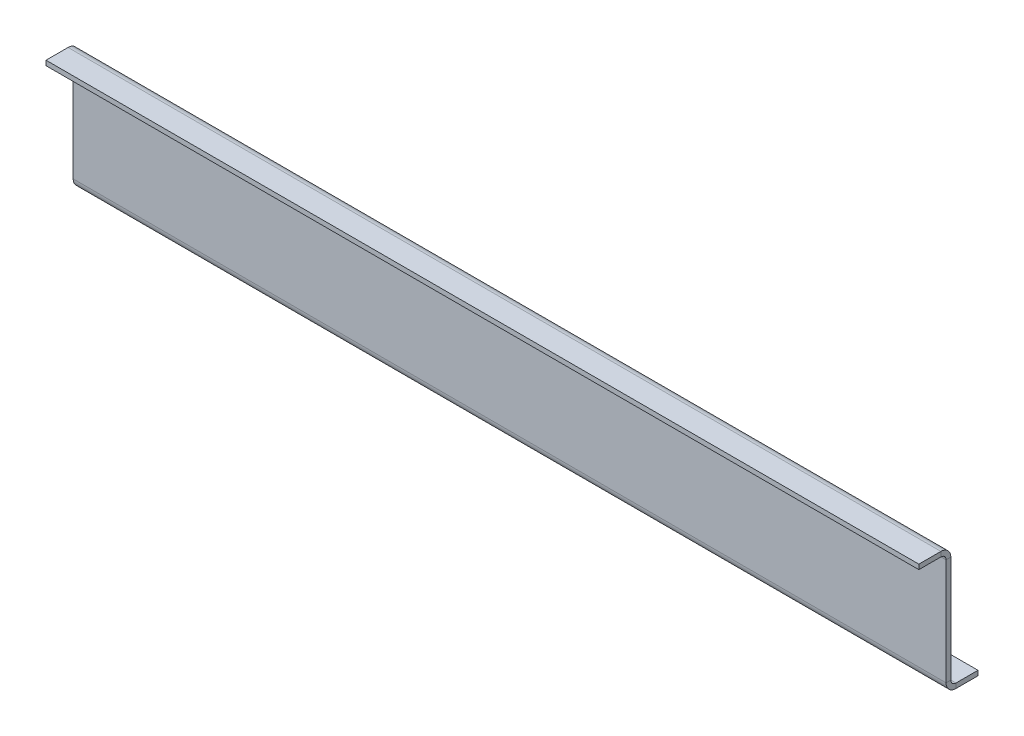
ISO-10303-21;
HEADER;
FILE_DESCRIPTION(('STEP AP214'),'2;1');
FILE_NAME('part.step','',(''),(''),'','','');
FILE_SCHEMA(('AUTOMOTIVE_DESIGN { 1 0 10303 214 1 1 1 1 }'));
ENDSEC;
DATA;
#1=APPLICATION_CONTEXT('core data for automotive mechanical design processes');
#2=APPLICATION_PROTOCOL_DEFINITION('international standard','automotive_design',2000,#1);
#3=PRODUCT_CONTEXT('',#1,'mechanical');
#4=PRODUCT('Part','Part','',(#3));
#5=PRODUCT_RELATED_PRODUCT_CATEGORY('part','',(#4));
#6=PRODUCT_DEFINITION_FORMATION('','',#4);
#7=PRODUCT_DEFINITION_CONTEXT('part definition',#1,'design');
#8=PRODUCT_DEFINITION('design','',#6,#7);
#9=PRODUCT_DEFINITION_SHAPE('','',#8);
#10=(LENGTH_UNIT() NAMED_UNIT(*) SI_UNIT(.MILLI.,.METRE.));
#11=(NAMED_UNIT(*) PLANE_ANGLE_UNIT() SI_UNIT($,.RADIAN.));
#12=(NAMED_UNIT(*) SI_UNIT($,.STERADIAN.) SOLID_ANGLE_UNIT());
#13=UNCERTAINTY_MEASURE_WITH_UNIT(LENGTH_MEASURE(1.E-05),#10,'distance_accuracy_value','');
#14=(GEOMETRIC_REPRESENTATION_CONTEXT(3) GLOBAL_UNCERTAINTY_ASSIGNED_CONTEXT((#13)) GLOBAL_UNIT_ASSIGNED_CONTEXT((#10,
#11,#12)) REPRESENTATION_CONTEXT('',''));
#15=CARTESIAN_POINT('',(0.,0.,0.));
#16=DIRECTION('',(0.,0.,1.));
#17=DIRECTION('',(1.,0.,0.));
#18=AXIS2_PLACEMENT_3D('',#15,#16,#17);
#19=CARTESIAN_POINT('',(-136.5,-19.75,-1.5));
#20=DIRECTION('',(-1.,0.,0.));
#21=DIRECTION('',(0.,0.,1.));
#22=AXIS2_PLACEMENT_3D('',#19,#20,#21);
#23=PLANE('',#22);
#24=DIRECTION('',(0.,-1.,0.));
#25=VECTOR('',#24,1.);
#26=CARTESIAN_POINT('',(-136.5,-19.75,-1.5));
#27=LINE('',#26,#25);
#28=CARTESIAN_POINT('',(-136.5,16.65,-1.5));
#29=VERTEX_POINT('',#28);
#30=CARTESIAN_POINT('',(-136.5,-16.65,-1.49999999999999));
#31=VERTEX_POINT('',#30);
#32=EDGE_CURVE('E87',#29,#31,#27,.T.);
#33=ORIENTED_EDGE('',*,*,#32,.T.);
#34=DIRECTION('',(0.,0.,1.));
#35=VECTOR('',#34,1.);
#36=CARTESIAN_POINT('',(-136.5,-16.65,-1.49999999999999));
#37=LINE('',#36,#35);
#38=CARTESIAN_POINT('',(-136.5,-16.65,0.));
#39=VERTEX_POINT('',#38);
#40=EDGE_CURVE('E226',#31,#39,#37,.T.);
#41=ORIENTED_EDGE('',*,*,#40,.T.);
#42=DIRECTION('',(0.,-1.,0.));
#43=VECTOR('',#42,1.);
#44=CARTESIAN_POINT('',(-136.5,-19.75,0.));
#45=LINE('',#44,#43);
#46=CARTESIAN_POINT('',(-136.5,16.65,0.));
#47=VERTEX_POINT('',#46);
#48=EDGE_CURVE('E288',#47,#39,#45,.T.);
#49=ORIENTED_EDGE('',*,*,#48,.F.);
#50=DIRECTION('',(0.,0.,-1.));
#51=VECTOR('',#50,1.);
#52=CARTESIAN_POINT('',(-136.5,16.65,0.));
#53=LINE('',#52,#51);
#54=EDGE_CURVE('E276',#47,#29,#53,.T.);
#55=ORIENTED_EDGE('',*,*,#54,.T.);
#56=EDGE_LOOP('',(#33,#41,#49,#55));
#57=FACE_BOUND('',#56,.T.);
#58=ADVANCED_FACE('F79',(#57),#23,.T.);
#59=CARTESIAN_POINT('',(0.,0.,-1.5));
#60=DIRECTION('',(0.,0.,1.));
#61=DIRECTION('',(1.,0.,0.));
#62=AXIS2_PLACEMENT_3D('',#59,#60,#61);
#63=PLANE('',#62);
#64=DIRECTION('',(-1.,0.,0.));
#65=VECTOR('',#64,1.);
#66=CARTESIAN_POINT('',(-136.5,-16.65,-1.49999999999999));
#67=LINE('',#66,#65);
#68=CARTESIAN_POINT('',(136.5,-16.65,-1.50000000000003));
#69=VERTEX_POINT('',#68);
#70=EDGE_CURVE('E230',#31,#69,#67,.F.);
#71=ORIENTED_EDGE('',*,*,#70,.F.);
#72=ORIENTED_EDGE('',*,*,#32,.F.);
#73=DIRECTION('',(-1.,0.,0.));
#74=VECTOR('',#73,1.);
#75=CARTESIAN_POINT('',(-136.5,16.65,-1.5));
#76=LINE('',#75,#74);
#77=CARTESIAN_POINT('',(136.5,16.65,-1.5));
#78=VERTEX_POINT('',#77);
#79=EDGE_CURVE('E270',#29,#78,#76,.F.);
#80=ORIENTED_EDGE('',*,*,#79,.T.);
#81=DIRECTION('',(0.,1.,0.));
#82=VECTOR('',#81,1.);
#83=CARTESIAN_POINT('',(136.5,-19.75,-1.5));
#84=LINE('',#83,#82);
#85=EDGE_CURVE('E13',#69,#78,#84,.T.);
#86=ORIENTED_EDGE('',*,*,#85,.F.);
#87=EDGE_LOOP('',(#71,#72,#80,#86));
#88=FACE_BOUND('',#87,.T.);
#89=ADVANCED_FACE('F330',(#88),#63,.F.);
#90=CARTESIAN_POINT('',(0.,0.,0.));
#91=DIRECTION('',(0.,0.,1.));
#92=DIRECTION('',(1.,0.,0.));
#93=AXIS2_PLACEMENT_3D('',#90,#91,#92);
#94=PLANE('',#93);
#95=ORIENTED_EDGE('',*,*,#48,.T.);
#96=DIRECTION('',(-1.,0.,0.));
#97=VECTOR('',#96,1.);
#98=CARTESIAN_POINT('',(-136.5,-16.65,0.));
#99=LINE('',#98,#97);
#100=CARTESIAN_POINT('',(136.5,-16.65,0.));
#101=VERTEX_POINT('',#100);
#102=EDGE_CURVE('E176',#39,#101,#99,.F.);
#103=ORIENTED_EDGE('',*,*,#102,.T.);
#104=DIRECTION('',(0.,1.,0.));
#105=VECTOR('',#104,1.);
#106=CARTESIAN_POINT('',(136.5,-19.75,0.));
#107=LINE('',#106,#105);
#108=CARTESIAN_POINT('',(136.5,16.65,0.));
#109=VERTEX_POINT('',#108);
#110=EDGE_CURVE('E82',#101,#109,#107,.T.);
#111=ORIENTED_EDGE('',*,*,#110,.T.);
#112=DIRECTION('',(-1.,0.,0.));
#113=VECTOR('',#112,1.);
#114=CARTESIAN_POINT('',(-136.5,16.65,0.));
#115=LINE('',#114,#113);
#116=EDGE_CURVE('E95',#47,#109,#115,.F.);
#117=ORIENTED_EDGE('',*,*,#116,.F.);
#118=EDGE_LOOP('',(#95,#103,#111,#117));
#119=FACE_BOUND('',#118,.T.);
#120=ADVANCED_FACE('F293',(#119),#94,.T.);
#121=CARTESIAN_POINT('',(136.5,-19.75,-1.5));
#122=DIRECTION('',(1.,0.,0.));
#123=DIRECTION('',(0.,0.,-1.));
#124=AXIS2_PLACEMENT_3D('',#121,#122,#123);
#125=PLANE('',#124);
#126=DIRECTION('',(0.,0.,1.));
#127=VECTOR('',#126,1.);
#128=CARTESIAN_POINT('',(136.5,-16.65,-1.50000000000003));
#129=LINE('',#128,#127);
#130=EDGE_CURVE('E233',#69,#101,#129,.T.);
#131=ORIENTED_EDGE('',*,*,#130,.F.);
#132=ORIENTED_EDGE('',*,*,#85,.T.);
#133=DIRECTION('',(0.,0.,-1.));
#134=VECTOR('',#133,1.);
#135=CARTESIAN_POINT('',(136.5,16.65,0.));
#136=LINE('',#135,#134);
#137=EDGE_CURVE('E285',#109,#78,#136,.T.);
#138=ORIENTED_EDGE('',*,*,#137,.F.);
#139=ORIENTED_EDGE('',*,*,#110,.F.);
#140=EDGE_LOOP('',(#131,#132,#138,#139));
#141=FACE_BOUND('',#140,.T.);
#142=ADVANCED_FACE('F294',(#141),#125,.T.);
#143=CARTESIAN_POINT('',(136.5,16.65,1.6));
#144=DIRECTION('',(1.,0.,0.));
#145=DIRECTION('',(0.,0.,-1.));
#146=AXIS2_PLACEMENT_3D('',#143,#144,#145);
#147=PLANE('',#146);
#148=DIRECTION('',(0.,1.,0.));
#149=VECTOR('',#148,1.);
#150=CARTESIAN_POINT('',(136.5,19.75,1.59999999999999));
#151=LINE('',#150,#149);
#152=CARTESIAN_POINT('',(136.5,18.25,1.59999999999999));
#153=VERTEX_POINT('',#152);
#154=CARTESIAN_POINT('',(136.5,19.75,1.59999999999999));
#155=VERTEX_POINT('',#154);
#156=EDGE_CURVE('E236',#153,#155,#151,.T.);
#157=ORIENTED_EDGE('',*,*,#156,.F.);
#158=CARTESIAN_POINT('',(136.5,16.65,1.6));
#159=DIRECTION('',(-1.,0.,0.));
#160=DIRECTION('',(0.,0.,1.));
#161=AXIS2_PLACEMENT_3D('',#158,#159,#160);
#162=CIRCLE('',#161,1.60000000000002);
#163=EDGE_CURVE('E279',#109,#153,#162,.F.);
#164=ORIENTED_EDGE('',*,*,#163,.F.);
#165=ORIENTED_EDGE('',*,*,#137,.T.);
#166=CARTESIAN_POINT('',(136.5,16.65,1.6));
#167=DIRECTION('',(-1.,0.,0.));
#168=DIRECTION('',(0.,0.,1.));
#169=AXIS2_PLACEMENT_3D('',#166,#167,#168);
#170=CIRCLE('',#169,3.10000000000002);
#171=EDGE_CURVE('E272',#78,#155,#170,.F.);
#172=ORIENTED_EDGE('',*,*,#171,.T.);
#173=EDGE_LOOP('',(#157,#164,#165,#172));
#174=FACE_BOUND('',#173,.T.);
#175=ADVANCED_FACE('F302',(#174),#147,.T.);
#176=CARTESIAN_POINT('',(-136.5,16.65,1.60000000000002));
#177=DIRECTION('',(1.,0.,0.));
#178=DIRECTION('',(0.,0.,-1.));
#179=AXIS2_PLACEMENT_3D('',#176,#177,#178);
#180=PLANE('',#179);
#181=CARTESIAN_POINT('',(-136.5,16.65,1.60000000000002));
#182=DIRECTION('',(-1.,0.,0.));
#183=DIRECTION('',(0.,0.,1.));
#184=AXIS2_PLACEMENT_3D('',#181,#182,#183);
#185=CIRCLE('',#184,1.60000000000002);
#186=CARTESIAN_POINT('',(-136.5,18.25,1.60000000000001));
#187=VERTEX_POINT('',#186);
#188=EDGE_CURVE('E240',#187,#47,#185,.T.);
#189=ORIENTED_EDGE('',*,*,#188,.F.);
#190=DIRECTION('',(0.,1.,0.));
#191=VECTOR('',#190,1.);
#192=CARTESIAN_POINT('',(-136.5,18.25,1.60000000000001));
#193=LINE('',#192,#191);
#194=CARTESIAN_POINT('',(-136.5,19.75,1.6));
#195=VERTEX_POINT('',#194);
#196=EDGE_CURVE('E263',#187,#195,#193,.T.);
#197=ORIENTED_EDGE('',*,*,#196,.T.);
#198=CARTESIAN_POINT('',(-136.5,16.65,1.60000000000002));
#199=DIRECTION('',(-1.,0.,0.));
#200=DIRECTION('',(0.,0.,1.));
#201=AXIS2_PLACEMENT_3D('',#198,#199,#200);
#202=CIRCLE('',#201,3.10000000000002);
#203=EDGE_CURVE('E273',#195,#29,#202,.T.);
#204=ORIENTED_EDGE('',*,*,#203,.T.);
#205=ORIENTED_EDGE('',*,*,#54,.F.);
#206=EDGE_LOOP('',(#189,#197,#204,#205));
#207=FACE_BOUND('',#206,.T.);
#208=ADVANCED_FACE('F322',(#207),#180,.F.);
#209=CARTESIAN_POINT('',(-136.5,16.65,1.60000000000002));
#210=DIRECTION('',(-1.,0.,0.));
#211=DIRECTION('',(0.,1.,0.));
#212=AXIS2_PLACEMENT_3D('',#209,#210,#211);
#213=CYLINDRICAL_SURFACE('',#212,3.10000000000002);
#214=ORIENTED_EDGE('',*,*,#79,.F.);
#215=ORIENTED_EDGE('',*,*,#203,.F.);
#216=DIRECTION('',(-1.,0.,0.));
#217=VECTOR('',#216,1.);
#218=CARTESIAN_POINT('',(0.,19.75,1.59999999999999));
#219=LINE('',#218,#217);
#220=EDGE_CURVE('E260',#155,#195,#219,.T.);
#221=ORIENTED_EDGE('',*,*,#220,.F.);
#222=ORIENTED_EDGE('',*,*,#171,.F.);
#223=EDGE_LOOP('',(#214,#215,#221,#222));
#224=FACE_BOUND('',#223,.T.);
#225=ADVANCED_FACE('F327',(#224),#213,.T.);
#226=CARTESIAN_POINT('',(-136.5,16.65,1.60000000000002));
#227=DIRECTION('',(-1.,0.,0.));
#228=DIRECTION('',(0.,1.,0.));
#229=AXIS2_PLACEMENT_3D('',#226,#227,#228);
#230=CYLINDRICAL_SURFACE('',#229,1.60000000000002);
#231=ORIENTED_EDGE('',*,*,#116,.T.);
#232=ORIENTED_EDGE('',*,*,#163,.T.);
#233=DIRECTION('',(1.,0.,0.));
#234=VECTOR('',#233,1.);
#235=CARTESIAN_POINT('',(136.5,18.25,1.59999999999999));
#236=LINE('',#235,#234);
#237=EDGE_CURVE('E266',#153,#187,#236,.F.);
#238=ORIENTED_EDGE('',*,*,#237,.T.);
#239=ORIENTED_EDGE('',*,*,#188,.T.);
#240=EDGE_LOOP('',(#231,#232,#238,#239));
#241=FACE_BOUND('',#240,.T.);
#242=ADVANCED_FACE('F299',(#241),#230,.F.);
#243=CARTESIAN_POINT('',(-136.5,19.75,0.));
#244=DIRECTION('',(-1.,0.,0.));
#245=DIRECTION('',(0.,0.,1.));
#246=AXIS2_PLACEMENT_3D('',#243,#244,#245);
#247=PLANE('',#246);
#248=DIRECTION('',(0.,0.,-1.));
#249=VECTOR('',#248,1.);
#250=CARTESIAN_POINT('',(-136.5,19.75,0.));
#251=LINE('',#250,#249);
#252=CARTESIAN_POINT('',(-136.5,19.75,8.5));
#253=VERTEX_POINT('',#252);
#254=EDGE_CURVE('E244',#253,#195,#251,.T.);
#255=ORIENTED_EDGE('',*,*,#254,.T.);
#256=ORIENTED_EDGE('',*,*,#196,.F.);
#257=DIRECTION('',(0.,0.,1.));
#258=VECTOR('',#257,1.);
#259=CARTESIAN_POINT('',(-136.5,18.25,3.73169632449834E-13));
#260=LINE('',#259,#258);
#261=CARTESIAN_POINT('',(-136.5,18.25,8.50000000000001));
#262=VERTEX_POINT('',#261);
#263=EDGE_CURVE('E252',#262,#187,#260,.F.);
#264=ORIENTED_EDGE('',*,*,#263,.F.);
#265=DIRECTION('',(0.,-1.,0.));
#266=VECTOR('',#265,1.);
#267=CARTESIAN_POINT('',(-136.5,19.75,8.5));
#268=LINE('',#267,#266);
#269=EDGE_CURVE('E238',#253,#262,#268,.T.);
#270=ORIENTED_EDGE('',*,*,#269,.F.);
#271=EDGE_LOOP('',(#255,#256,#264,#270));
#272=FACE_BOUND('',#271,.T.);
#273=ADVANCED_FACE('F320',(#272),#247,.T.);
#274=CARTESIAN_POINT('',(136.5,19.7500000000001,8.5));
#275=DIRECTION('',(1.,0.,0.));
#276=DIRECTION('',(0.,0.,-1.));
#277=AXIS2_PLACEMENT_3D('',#274,#275,#276);
#278=PLANE('',#277);
#279=DIRECTION('',(0.,0.,-1.));
#280=VECTOR('',#279,1.);
#281=CARTESIAN_POINT('',(136.5,18.25,-5.18274149087424E-13));
#282=LINE('',#281,#280);
#283=CARTESIAN_POINT('',(136.5,18.25,8.50000000000001));
#284=VERTEX_POINT('',#283);
#285=EDGE_CURVE('E258',#153,#284,#282,.F.);
#286=ORIENTED_EDGE('',*,*,#285,.F.);
#287=ORIENTED_EDGE('',*,*,#156,.T.);
#288=DIRECTION('',(0.,0.,1.));
#289=VECTOR('',#288,1.);
#290=CARTESIAN_POINT('',(136.5,19.7500000000001,8.5));
#291=LINE('',#290,#289);
#292=CARTESIAN_POINT('',(136.5,19.7500000000001,8.5));
#293=VERTEX_POINT('',#292);
#294=EDGE_CURVE('E250',#155,#293,#291,.T.);
#295=ORIENTED_EDGE('',*,*,#294,.T.);
#296=DIRECTION('',(0.,-1.,0.));
#297=VECTOR('',#296,1.);
#298=CARTESIAN_POINT('',(136.5,19.7500000000001,8.5));
#299=LINE('',#298,#297);
#300=EDGE_CURVE('E241',#293,#284,#299,.T.);
#301=ORIENTED_EDGE('',*,*,#300,.T.);
#302=EDGE_LOOP('',(#286,#287,#295,#301));
#303=FACE_BOUND('',#302,.T.);
#304=ADVANCED_FACE('F306',(#303),#278,.T.);
#305=CARTESIAN_POINT('',(0.,19.75,0.));
#306=DIRECTION('',(0.,1.,0.));
#307=DIRECTION('',(0.,0.,1.));
#308=AXIS2_PLACEMENT_3D('',#305,#306,#307);
#309=PLANE('',#308);
#310=ORIENTED_EDGE('',*,*,#294,.F.);
#311=ORIENTED_EDGE('',*,*,#220,.T.);
#312=ORIENTED_EDGE('',*,*,#254,.F.);
#313=DIRECTION('',(-1.,0.,0.));
#314=VECTOR('',#313,1.);
#315=CARTESIAN_POINT('',(-136.5,19.75,8.5));
#316=LINE('',#315,#314);
#317=EDGE_CURVE('E247',#293,#253,#316,.T.);
#318=ORIENTED_EDGE('',*,*,#317,.F.);
#319=EDGE_LOOP('',(#310,#311,#312,#318));
#320=FACE_BOUND('',#319,.T.);
#321=ADVANCED_FACE('F310',(#320),#309,.T.);
#322=CARTESIAN_POINT('',(0.,18.25,0.));
#323=DIRECTION('',(0.,1.,0.));
#324=DIRECTION('',(0.,0.,1.));
#325=AXIS2_PLACEMENT_3D('',#322,#323,#324);
#326=PLANE('',#325);
#327=ORIENTED_EDGE('',*,*,#237,.F.);
#328=ORIENTED_EDGE('',*,*,#285,.T.);
#329=DIRECTION('',(1.,0.,0.));
#330=VECTOR('',#329,1.);
#331=CARTESIAN_POINT('',(0.,18.25,8.50000000000001));
#332=LINE('',#331,#330);
#333=EDGE_CURVE('E255',#284,#262,#332,.F.);
#334=ORIENTED_EDGE('',*,*,#333,.T.);
#335=ORIENTED_EDGE('',*,*,#263,.T.);
#336=EDGE_LOOP('',(#327,#328,#334,#335));
#337=FACE_BOUND('',#336,.T.);
#338=ADVANCED_FACE('F317',(#337),#326,.F.);
#339=CARTESIAN_POINT('',(-136.5,19.75,8.5));
#340=DIRECTION('',(0.,0.,1.));
#341=DIRECTION('',(0.,-1.,0.));
#342=AXIS2_PLACEMENT_3D('',#339,#340,#341);
#343=PLANE('',#342);
#344=ORIENTED_EDGE('',*,*,#333,.F.);
#345=ORIENTED_EDGE('',*,*,#300,.F.);
#346=ORIENTED_EDGE('',*,*,#317,.T.);
#347=ORIENTED_EDGE('',*,*,#269,.T.);
#348=EDGE_LOOP('',(#344,#345,#346,#347));
#349=FACE_BOUND('',#348,.T.);
#350=ADVANCED_FACE('F314',(#349),#343,.T.);
#351=CARTESIAN_POINT('',(136.5,-16.65,-3.10000000000001));
#352=DIRECTION('',(1.,0.,0.));
#353=DIRECTION('',(0.,0.,-1.));
#354=AXIS2_PLACEMENT_3D('',#351,#352,#353);
#355=PLANE('',#354);
#356=DIRECTION('',(0.,-1.,0.));
#357=VECTOR('',#356,1.);
#358=CARTESIAN_POINT('',(136.5,-19.75,-3.09999999999999));
#359=LINE('',#358,#357);
#360=CARTESIAN_POINT('',(136.5,-18.25,-3.1));
#361=VERTEX_POINT('',#360);
#362=CARTESIAN_POINT('',(136.5,-19.75,-3.1));
#363=VERTEX_POINT('',#362);
#364=EDGE_CURVE('E221',#361,#363,#359,.T.);
#365=ORIENTED_EDGE('',*,*,#364,.F.);
#366=CARTESIAN_POINT('',(136.5,-16.65,-3.10000000000001));
#367=DIRECTION('',(-1.,0.,0.));
#368=DIRECTION('',(0.,0.,1.));
#369=AXIS2_PLACEMENT_3D('',#366,#367,#368);
#370=CIRCLE('',#369,1.59999999999998);
#371=EDGE_CURVE('E179',#69,#361,#370,.F.);
#372=ORIENTED_EDGE('',*,*,#371,.F.);
#373=ORIENTED_EDGE('',*,*,#130,.T.);
#374=CARTESIAN_POINT('',(136.5,-16.65,-3.10000000000001));
#375=DIRECTION('',(-1.,0.,0.));
#376=DIRECTION('',(0.,0.,1.));
#377=AXIS2_PLACEMENT_3D('',#374,#375,#376);
#378=CIRCLE('',#377,3.09999999999998);
#379=EDGE_CURVE('E225',#101,#363,#378,.F.);
#380=ORIENTED_EDGE('',*,*,#379,.T.);
#381=EDGE_LOOP('',(#365,#372,#373,#380));
#382=FACE_BOUND('',#381,.T.);
#383=ADVANCED_FACE('F336',(#382),#355,.T.);
#384=CARTESIAN_POINT('',(-136.5,-16.65,-3.09999999999997));
#385=DIRECTION('',(1.,0.,0.));
#386=DIRECTION('',(0.,0.,-1.));
#387=AXIS2_PLACEMENT_3D('',#384,#385,#386);
#388=PLANE('',#387);
#389=CARTESIAN_POINT('',(-136.5,-16.65,-3.09999999999997));
#390=DIRECTION('',(-1.,0.,0.));
#391=DIRECTION('',(0.,0.,1.));
#392=AXIS2_PLACEMENT_3D('',#389,#390,#391);
#393=CIRCLE('',#392,1.59999999999998);
#394=CARTESIAN_POINT('',(-136.5,-18.25,-3.09999999999997));
#395=VERTEX_POINT('',#394);
#396=EDGE_CURVE('E186',#395,#31,#393,.T.);
#397=ORIENTED_EDGE('',*,*,#396,.F.);
#398=DIRECTION('',(0.,-1.,0.));
#399=VECTOR('',#398,1.);
#400=CARTESIAN_POINT('',(-136.5,-18.25,-3.09999999999998));
#401=LINE('',#400,#399);
#402=CARTESIAN_POINT('',(-136.5,-19.75,-3.09999999999997));
#403=VERTEX_POINT('',#402);
#404=EDGE_CURVE('E183',#395,#403,#401,.T.);
#405=ORIENTED_EDGE('',*,*,#404,.T.);
#406=CARTESIAN_POINT('',(-136.5,-16.65,-3.09999999999997));
#407=DIRECTION('',(-1.,0.,0.));
#408=DIRECTION('',(0.,0.,1.));
#409=AXIS2_PLACEMENT_3D('',#406,#407,#408);
#410=CIRCLE('',#409,3.09999999999998);
#411=EDGE_CURVE('E169',#403,#39,#410,.T.);
#412=ORIENTED_EDGE('',*,*,#411,.T.);
#413=ORIENTED_EDGE('',*,*,#40,.F.);
#414=EDGE_LOOP('',(#397,#405,#412,#413));
#415=FACE_BOUND('',#414,.T.);
#416=ADVANCED_FACE('F184',(#415),#388,.F.);
#417=CARTESIAN_POINT('',(-136.5,-16.65,-3.09999999999997));
#418=DIRECTION('',(-1.,0.,0.));
#419=DIRECTION('',(0.,-1.,0.));
#420=AXIS2_PLACEMENT_3D('',#417,#418,#419);
#421=CYLINDRICAL_SURFACE('',#420,3.09999999999998);
#422=ORIENTED_EDGE('',*,*,#102,.F.);
#423=ORIENTED_EDGE('',*,*,#411,.F.);
#424=DIRECTION('',(-1.,0.,0.));
#425=VECTOR('',#424,1.);
#426=CARTESIAN_POINT('',(0.,-19.75,-3.09999999999998));
#427=LINE('',#426,#425);
#428=EDGE_CURVE('E173',#363,#403,#427,.T.);
#429=ORIENTED_EDGE('',*,*,#428,.F.);
#430=ORIENTED_EDGE('',*,*,#379,.F.);
#431=EDGE_LOOP('',(#422,#423,#429,#430));
#432=FACE_BOUND('',#431,.T.);
#433=ADVANCED_FACE('F171',(#432),#421,.T.);
#434=CARTESIAN_POINT('',(-136.5,-16.65,-3.09999999999997));
#435=DIRECTION('',(-1.,0.,0.));
#436=DIRECTION('',(0.,-1.,0.));
#437=AXIS2_PLACEMENT_3D('',#434,#435,#436);
#438=CYLINDRICAL_SURFACE('',#437,1.59999999999998);
#439=ORIENTED_EDGE('',*,*,#70,.T.);
#440=ORIENTED_EDGE('',*,*,#371,.T.);
#441=DIRECTION('',(1.,0.,0.));
#442=VECTOR('',#441,1.);
#443=CARTESIAN_POINT('',(136.5,-18.25,-3.1));
#444=LINE('',#443,#442);
#445=EDGE_CURVE('E191',#361,#395,#444,.F.);
#446=ORIENTED_EDGE('',*,*,#445,.T.);
#447=ORIENTED_EDGE('',*,*,#396,.T.);
#448=EDGE_LOOP('',(#439,#440,#446,#447));
#449=FACE_BOUND('',#448,.T.);
#450=ADVANCED_FACE('F333',(#449),#438,.F.);
#451=CARTESIAN_POINT('',(-136.5,-19.75,-1.49999999999999));
#452=DIRECTION('',(-1.,0.,0.));
#453=DIRECTION('',(0.,0.,1.));
#454=AXIS2_PLACEMENT_3D('',#451,#452,#453);
#455=PLANE('',#454);
#456=DIRECTION('',(0.,0.,1.));
#457=VECTOR('',#456,1.);
#458=CARTESIAN_POINT('',(-136.5,-19.75,-1.49999999999999));
#459=LINE('',#458,#457);
#460=CARTESIAN_POINT('',(-136.5,-19.75,-10.));
#461=VERTEX_POINT('',#460);
#462=EDGE_CURVE('E198',#461,#403,#459,.T.);
#463=ORIENTED_EDGE('',*,*,#462,.T.);
#464=ORIENTED_EDGE('',*,*,#404,.F.);
#465=DIRECTION('',(0.,0.,-1.));
#466=VECTOR('',#465,1.);
#467=CARTESIAN_POINT('',(-136.5,-18.25,-3.73169632449834E-13));
#468=LINE('',#467,#466);
#469=CARTESIAN_POINT('',(-136.5,-18.25,-10.));
#470=VERTEX_POINT('',#469);
#471=EDGE_CURVE('E214',#470,#395,#468,.F.);
#472=ORIENTED_EDGE('',*,*,#471,.F.);
#473=DIRECTION('',(0.,1.,0.));
#474=VECTOR('',#473,1.);
#475=CARTESIAN_POINT('',(-136.5,-19.75,-10.));
#476=LINE('',#475,#474);
#477=EDGE_CURVE('E203',#461,#470,#476,.T.);
#478=ORIENTED_EDGE('',*,*,#477,.F.);
#479=EDGE_LOOP('',(#463,#464,#472,#478));
#480=FACE_BOUND('',#479,.T.);
#481=ADVANCED_FACE('F202',(#480),#455,.T.);
#482=CARTESIAN_POINT('',(136.5,-19.75,-10.));
#483=DIRECTION('',(1.,0.,0.));
#484=DIRECTION('',(0.,0.,-1.));
#485=AXIS2_PLACEMENT_3D('',#482,#483,#484);
#486=PLANE('',#485);
#487=DIRECTION('',(0.,0.,1.));
#488=VECTOR('',#487,1.);
#489=CARTESIAN_POINT('',(136.5,-18.25,5.18274149087423E-13));
#490=LINE('',#489,#488);
#491=CARTESIAN_POINT('',(136.5,-18.25,-10.));
#492=VERTEX_POINT('',#491);
#493=EDGE_CURVE('E200',#361,#492,#490,.F.);
#494=ORIENTED_EDGE('',*,*,#493,.F.);
#495=ORIENTED_EDGE('',*,*,#364,.T.);
#496=DIRECTION('',(0.,0.,-1.));
#497=VECTOR('',#496,1.);
#498=CARTESIAN_POINT('',(136.5,-19.75,-10.));
#499=LINE('',#498,#497);
#500=CARTESIAN_POINT('',(136.5,-19.75,-10.));
#501=VERTEX_POINT('',#500);
#502=EDGE_CURVE('E199',#363,#501,#499,.T.);
#503=ORIENTED_EDGE('',*,*,#502,.T.);
#504=DIRECTION('',(0.,1.,0.));
#505=VECTOR('',#504,1.);
#506=CARTESIAN_POINT('',(136.5,-19.75,-10.));
#507=LINE('',#506,#505);
#508=EDGE_CURVE('E205',#501,#492,#507,.T.);
#509=ORIENTED_EDGE('',*,*,#508,.T.);
#510=EDGE_LOOP('',(#494,#495,#503,#509));
#511=FACE_BOUND('',#510,.T.);
#512=ADVANCED_FACE('F339',(#511),#486,.T.);
#513=CARTESIAN_POINT('',(0.,-19.75,0.));
#514=DIRECTION('',(0.,-1.,0.));
#515=DIRECTION('',(0.,0.,-1.));
#516=AXIS2_PLACEMENT_3D('',#513,#514,#515);
#517=PLANE('',#516);
#518=ORIENTED_EDGE('',*,*,#502,.F.);
#519=ORIENTED_EDGE('',*,*,#428,.T.);
#520=ORIENTED_EDGE('',*,*,#462,.F.);
#521=DIRECTION('',(-1.,0.,0.));
#522=VECTOR('',#521,1.);
#523=CARTESIAN_POINT('',(-136.5,-19.75,-10.));
#524=LINE('',#523,#522);
#525=EDGE_CURVE('E206',#501,#461,#524,.T.);
#526=ORIENTED_EDGE('',*,*,#525,.F.);
#527=EDGE_LOOP('',(#518,#519,#520,#526));
#528=FACE_BOUND('',#527,.T.);
#529=ADVANCED_FACE('F196',(#528),#517,.T.);
#530=CARTESIAN_POINT('',(0.,-18.25,0.));
#531=DIRECTION('',(0.,-1.,0.));
#532=DIRECTION('',(0.,0.,-1.));
#533=AXIS2_PLACEMENT_3D('',#530,#531,#532);
#534=PLANE('',#533);
#535=ORIENTED_EDGE('',*,*,#445,.F.);
#536=ORIENTED_EDGE('',*,*,#493,.T.);
#537=DIRECTION('',(1.,0.,0.));
#538=VECTOR('',#537,1.);
#539=CARTESIAN_POINT('',(0.,-18.25,-10.));
#540=LINE('',#539,#538);
#541=EDGE_CURVE('E216',#492,#470,#540,.F.);
#542=ORIENTED_EDGE('',*,*,#541,.T.);
#543=ORIENTED_EDGE('',*,*,#471,.T.);
#544=EDGE_LOOP('',(#535,#536,#542,#543));
#545=FACE_BOUND('',#544,.T.);
#546=ADVANCED_FACE('F343',(#545),#534,.F.);
#547=CARTESIAN_POINT('',(-136.5,-19.75,-10.));
#548=DIRECTION('',(0.,0.,-1.));
#549=DIRECTION('',(0.,1.,0.));
#550=AXIS2_PLACEMENT_3D('',#547,#548,#549);
#551=PLANE('',#550);
#552=ORIENTED_EDGE('',*,*,#541,.F.);
#553=ORIENTED_EDGE('',*,*,#508,.F.);
#554=ORIENTED_EDGE('',*,*,#525,.T.);
#555=ORIENTED_EDGE('',*,*,#477,.T.);
#556=EDGE_LOOP('',(#552,#553,#554,#555));
#557=FACE_BOUND('',#556,.T.);
#558=ADVANCED_FACE('F345',(#557),#551,.T.);
#559=CLOSED_SHELL('',(#58,#89,#120,#142,#175,#208,#225,#242,#273,#304,#321,#338,#350,#383,#416,
#433,#450,#481,#512,#529,#546,#558));
#560=MANIFOLD_SOLID_BREP('B2',#559);
#561=ADVANCED_BREP_SHAPE_REPRESENTATION('',(#18,#560),#14);
#562=SHAPE_DEFINITION_REPRESENTATION(#9,#561);
ENDSEC;
END-ISO-10303-21;
